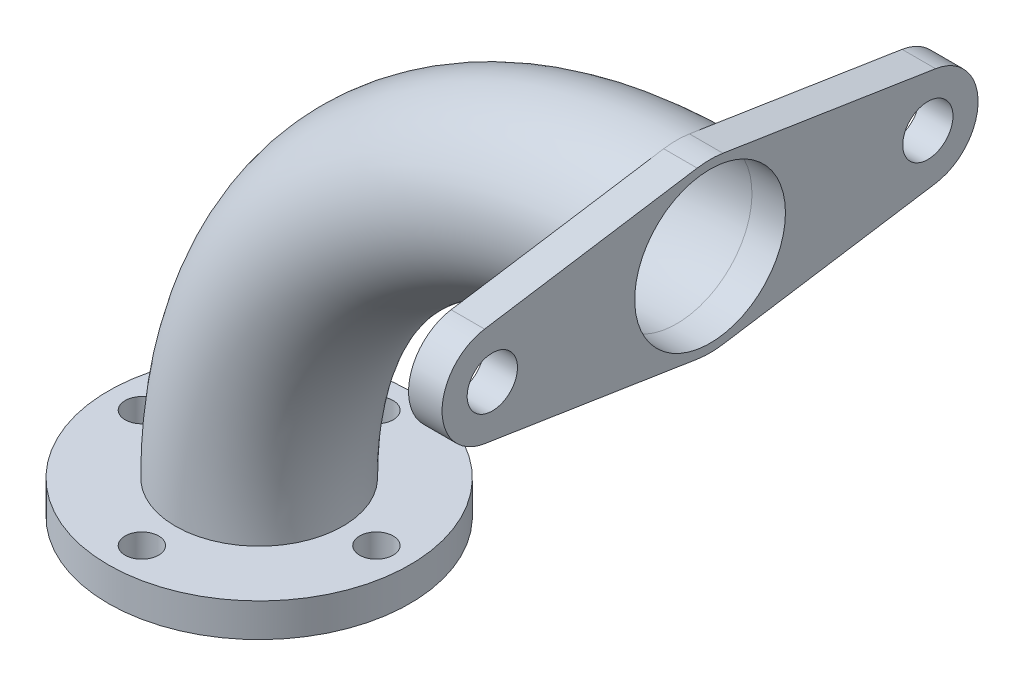
ISO-10303-21;
HEADER;
FILE_DESCRIPTION(('STEP AP214'),'2;1');
FILE_NAME('part.step','',(''),(''),'','','');
FILE_SCHEMA(('AUTOMOTIVE_DESIGN { 1 0 10303 214 1 1 1 1 }'));
ENDSEC;
DATA;
#1=APPLICATION_CONTEXT('core data for automotive mechanical design processes');
#2=APPLICATION_PROTOCOL_DEFINITION('international standard','automotive_design',2000,#1);
#3=PRODUCT_CONTEXT('',#1,'mechanical');
#4=PRODUCT('Part','Part','',(#3));
#5=PRODUCT_RELATED_PRODUCT_CATEGORY('part','',(#4));
#6=PRODUCT_DEFINITION_FORMATION('','',#4);
#7=PRODUCT_DEFINITION_CONTEXT('part definition',#1,'design');
#8=PRODUCT_DEFINITION('design','',#6,#7);
#9=PRODUCT_DEFINITION_SHAPE('','',#8);
#10=(LENGTH_UNIT() NAMED_UNIT(*) SI_UNIT(.MILLI.,.METRE.));
#11=(NAMED_UNIT(*) PLANE_ANGLE_UNIT() SI_UNIT($,.RADIAN.));
#12=(NAMED_UNIT(*) SI_UNIT($,.STERADIAN.) SOLID_ANGLE_UNIT());
#13=UNCERTAINTY_MEASURE_WITH_UNIT(LENGTH_MEASURE(1.E-05),#10,'distance_accuracy_value','');
#14=(GEOMETRIC_REPRESENTATION_CONTEXT(3) GLOBAL_UNCERTAINTY_ASSIGNED_CONTEXT((#13)) GLOBAL_UNIT_ASSIGNED_CONTEXT((#10,
#11,#12)) REPRESENTATION_CONTEXT('',''));
#15=CARTESIAN_POINT('',(0.,0.,0.));
#16=DIRECTION('',(0.,0.,1.));
#17=DIRECTION('',(1.,0.,0.));
#18=AXIS2_PLACEMENT_3D('',#15,#16,#17);
#19=CARTESIAN_POINT('',(0.,10.,0.));
#20=DIRECTION('',(0.,1.,0.));
#21=DIRECTION('',(0.,0.,1.));
#22=AXIS2_PLACEMENT_3D('',#19,#20,#21);
#23=PLANE('',#22);
#24=CARTESIAN_POINT('',(-35.,10.,0.));
#25=DIRECTION('',(0.,1.,0.));
#26=DIRECTION('',(0.,0.,1.));
#27=AXIS2_PLACEMENT_3D('',#24,#25,#26);
#28=CIRCLE('',#27,5.00000000000036);
#29=CARTESIAN_POINT('',(-35.,10.,5.00000000000036));
#30=VERTEX_POINT('',#29);
#31=EDGE_CURVE('E142',#30,#30,#28,.T.);
#32=ORIENTED_EDGE('',*,*,#31,.F.);
#33=EDGE_LOOP('',(#32));
#34=FACE_BOUND('',#33,.T.);
#35=CARTESIAN_POINT('',(35.,10.,0.));
#36=DIRECTION('',(0.,1.,0.));
#37=DIRECTION('',(0.,0.,1.));
#38=AXIS2_PLACEMENT_3D('',#35,#36,#37);
#39=CIRCLE('',#38,5.00000000000012);
#40=CARTESIAN_POINT('',(35.,10.,5.00000000000012));
#41=VERTEX_POINT('',#40);
#42=EDGE_CURVE('E154',#41,#41,#39,.T.);
#43=ORIENTED_EDGE('',*,*,#42,.F.);
#44=EDGE_LOOP('',(#43));
#45=FACE_BOUND('',#44,.T.);
#46=CARTESIAN_POINT('',(0.,10.,-35.));
#47=DIRECTION('',(0.,1.,0.));
#48=DIRECTION('',(0.,0.,1.));
#49=AXIS2_PLACEMENT_3D('',#46,#47,#48);
#50=CIRCLE('',#49,5.);
#51=CARTESIAN_POINT('',(0.,10.,-30.));
#52=VERTEX_POINT('',#51);
#53=EDGE_CURVE('E166',#52,#52,#50,.T.);
#54=ORIENTED_EDGE('',*,*,#53,.F.);
#55=EDGE_LOOP('',(#54));
#56=FACE_BOUND('',#55,.T.);
#57=CARTESIAN_POINT('',(0.,10.,0.));
#58=DIRECTION('',(0.,1.,0.));
#59=DIRECTION('',(0.,0.,1.));
#60=AXIS2_PLACEMENT_3D('',#57,#58,#59);
#61=CIRCLE('',#60,45.);
#62=CARTESIAN_POINT('',(0.,10.,45.));
#63=VERTEX_POINT('',#62);
#64=EDGE_CURVE('E11',#63,#63,#61,.T.);
#65=ORIENTED_EDGE('',*,*,#64,.T.);
#66=EDGE_LOOP('',(#65));
#67=FACE_BOUND('',#66,.T.);
#68=CARTESIAN_POINT('',(0.,10.,35.));
#69=DIRECTION('',(0.,1.,0.));
#70=DIRECTION('',(0.,0.,1.));
#71=AXIS2_PLACEMENT_3D('',#68,#69,#70);
#72=CIRCLE('',#71,5.00000000000024);
#73=CARTESIAN_POINT('',(0.,10.,40.0000000000002));
#74=VERTEX_POINT('',#73);
#75=EDGE_CURVE('E148',#74,#74,#72,.T.);
#76=ORIENTED_EDGE('',*,*,#75,.F.);
#77=EDGE_LOOP('',(#76));
#78=FACE_BOUND('',#77,.T.);
#79=CARTESIAN_POINT('',(0.,10.,0.));
#80=DIRECTION('',(0.,1.,0.));
#81=DIRECTION('',(0.,0.,1.));
#82=AXIS2_PLACEMENT_3D('',#79,#80,#81);
#83=CIRCLE('',#82,25.);
#84=CARTESIAN_POINT('',(0.,10.,25.));
#85=VERTEX_POINT('',#84);
#86=EDGE_CURVE('E138',#85,#85,#83,.T.);
#87=ORIENTED_EDGE('',*,*,#86,.F.);
#88=EDGE_LOOP('',(#87));
#89=FACE_BOUND('',#88,.T.);
#90=ADVANCED_FACE('F35',(#34,#45,#56,#67,#78,#89),#23,.T.);
#91=CARTESIAN_POINT('',(0.,0.,0.));
#92=DIRECTION('',(0.,1.,0.));
#93=DIRECTION('',(0.,0.,1.));
#94=AXIS2_PLACEMENT_3D('',#91,#92,#93);
#95=PLANE('',#94);
#96=CARTESIAN_POINT('',(0.,0.,0.));
#97=DIRECTION('',(0.,1.,0.));
#98=DIRECTION('',(0.,0.,1.));
#99=AXIS2_PLACEMENT_3D('',#96,#97,#98);
#100=CIRCLE('',#99,45.);
#101=CARTESIAN_POINT('',(0.,0.,45.));
#102=VERTEX_POINT('',#101);
#103=EDGE_CURVE('E39',#102,#102,#100,.T.);
#104=ORIENTED_EDGE('',*,*,#103,.F.);
#105=EDGE_LOOP('',(#104));
#106=FACE_BOUND('',#105,.T.);
#107=CARTESIAN_POINT('',(0.,0.,-35.));
#108=DIRECTION('',(0.,1.,0.));
#109=DIRECTION('',(0.,0.,1.));
#110=AXIS2_PLACEMENT_3D('',#107,#108,#109);
#111=CIRCLE('',#110,5.);
#112=CARTESIAN_POINT('',(0.,0.,-30.));
#113=VERTEX_POINT('',#112);
#114=EDGE_CURVE('E163',#113,#113,#111,.T.);
#115=ORIENTED_EDGE('',*,*,#114,.T.);
#116=EDGE_LOOP('',(#115));
#117=FACE_BOUND('',#116,.T.);
#118=CARTESIAN_POINT('',(0.,0.,0.));
#119=DIRECTION('',(0.,1.,0.));
#120=DIRECTION('',(0.,0.,1.));
#121=AXIS2_PLACEMENT_3D('',#118,#119,#120);
#122=CIRCLE('',#121,22.5);
#123=CARTESIAN_POINT('',(0.,0.,22.5));
#124=VERTEX_POINT('',#123);
#125=EDGE_CURVE('E157',#124,#124,#122,.T.);
#126=ORIENTED_EDGE('',*,*,#125,.T.);
#127=EDGE_LOOP('',(#126));
#128=FACE_BOUND('',#127,.T.);
#129=CARTESIAN_POINT('',(35.,0.,0.));
#130=DIRECTION('',(0.,1.,0.));
#131=DIRECTION('',(0.,0.,1.));
#132=AXIS2_PLACEMENT_3D('',#129,#130,#131);
#133=CIRCLE('',#132,5.00000000000012);
#134=CARTESIAN_POINT('',(35.,0.,5.00000000000012));
#135=VERTEX_POINT('',#134);
#136=EDGE_CURVE('E151',#135,#135,#133,.T.);
#137=ORIENTED_EDGE('',*,*,#136,.T.);
#138=EDGE_LOOP('',(#137));
#139=FACE_BOUND('',#138,.T.);
#140=CARTESIAN_POINT('',(0.,0.,35.));
#141=DIRECTION('',(0.,1.,0.));
#142=DIRECTION('',(0.,0.,1.));
#143=AXIS2_PLACEMENT_3D('',#140,#141,#142);
#144=CIRCLE('',#143,5.00000000000024);
#145=CARTESIAN_POINT('',(0.,0.,40.0000000000002));
#146=VERTEX_POINT('',#145);
#147=EDGE_CURVE('E145',#146,#146,#144,.T.);
#148=ORIENTED_EDGE('',*,*,#147,.T.);
#149=EDGE_LOOP('',(#148));
#150=FACE_BOUND('',#149,.T.);
#151=CARTESIAN_POINT('',(-35.,0.,0.));
#152=DIRECTION('',(0.,1.,0.));
#153=DIRECTION('',(0.,0.,1.));
#154=AXIS2_PLACEMENT_3D('',#151,#152,#153);
#155=CIRCLE('',#154,5.00000000000036);
#156=CARTESIAN_POINT('',(-35.,0.,5.00000000000036));
#157=VERTEX_POINT('',#156);
#158=EDGE_CURVE('E137',#157,#157,#155,.T.);
#159=ORIENTED_EDGE('',*,*,#158,.T.);
#160=EDGE_LOOP('',(#159));
#161=FACE_BOUND('',#160,.T.);
#162=ADVANCED_FACE('F172',(#106,#117,#128,#139,#150,#161),#95,.F.);
#163=CARTESIAN_POINT('',(0.,10.,0.));
#164=DIRECTION('',(0.,-1.,0.));
#165=DIRECTION('',(0.,0.,-1.));
#166=AXIS2_PLACEMENT_3D('',#163,#164,#165);
#167=CYLINDRICAL_SURFACE('',#166,45.);
#168=ORIENTED_EDGE('',*,*,#64,.F.);
#169=EDGE_LOOP('',(#168));
#170=FACE_BOUND('',#169,.T.);
#171=ORIENTED_EDGE('',*,*,#103,.T.);
#172=EDGE_LOOP('',(#171));
#173=FACE_BOUND('',#172,.T.);
#174=ADVANCED_FACE('F37',(#170,#173),#167,.T.);
#175=CARTESIAN_POINT('',(0.,10.,-35.));
#176=DIRECTION('',(0.,-1.,0.));
#177=DIRECTION('',(0.,0.,-1.));
#178=AXIS2_PLACEMENT_3D('',#175,#176,#177);
#179=CYLINDRICAL_SURFACE('',#178,5.);
#180=ORIENTED_EDGE('',*,*,#53,.T.);
#181=EDGE_LOOP('',(#180));
#182=FACE_BOUND('',#181,.T.);
#183=ORIENTED_EDGE('',*,*,#114,.F.);
#184=EDGE_LOOP('',(#183));
#185=FACE_BOUND('',#184,.T.);
#186=ADVANCED_FACE('F175',(#182,#185),#179,.F.);
#187=CARTESIAN_POINT('',(0.,10.,0.));
#188=DIRECTION('',(0.,-1.,0.));
#189=DIRECTION('',(0.,0.,-1.));
#190=AXIS2_PLACEMENT_3D('',#187,#188,#189);
#191=CYLINDRICAL_SURFACE('',#190,22.5);
#192=CARTESIAN_POINT('',(0.,10.,0.));
#193=DIRECTION('',(0.,1.,0.));
#194=DIRECTION('',(0.,0.,1.));
#195=AXIS2_PLACEMENT_3D('',#192,#193,#194);
#196=CIRCLE('',#195,22.5);
#197=CARTESIAN_POINT('',(-22.5,10.,0.));
#198=VERTEX_POINT('',#197);
#199=EDGE_CURVE('E160',#198,#198,#196,.T.);
#200=ORIENTED_EDGE('',*,*,#199,.T.);
#201=EDGE_LOOP('',(#200));
#202=FACE_BOUND('',#201,.T.);
#203=ORIENTED_EDGE('',*,*,#125,.F.);
#204=EDGE_LOOP('',(#203));
#205=FACE_BOUND('',#204,.T.);
#206=ADVANCED_FACE('F177',(#202,#205),#191,.F.);
#207=CARTESIAN_POINT('',(35.,10.,0.));
#208=DIRECTION('',(0.,-1.,0.));
#209=DIRECTION('',(0.,0.,-1.));
#210=AXIS2_PLACEMENT_3D('',#207,#208,#209);
#211=CYLINDRICAL_SURFACE('',#210,5.00000000000012);
#212=ORIENTED_EDGE('',*,*,#42,.T.);
#213=EDGE_LOOP('',(#212));
#214=FACE_BOUND('',#213,.T.);
#215=ORIENTED_EDGE('',*,*,#136,.F.);
#216=EDGE_LOOP('',(#215));
#217=FACE_BOUND('',#216,.T.);
#218=ADVANCED_FACE('F184',(#214,#217),#211,.F.);
#219=CARTESIAN_POINT('',(0.,10.,35.));
#220=DIRECTION('',(0.,-1.,0.));
#221=DIRECTION('',(0.,0.,-1.));
#222=AXIS2_PLACEMENT_3D('',#219,#220,#221);
#223=CYLINDRICAL_SURFACE('',#222,5.00000000000024);
#224=ORIENTED_EDGE('',*,*,#75,.T.);
#225=EDGE_LOOP('',(#224));
#226=FACE_BOUND('',#225,.T.);
#227=ORIENTED_EDGE('',*,*,#147,.F.);
#228=EDGE_LOOP('',(#227));
#229=FACE_BOUND('',#228,.T.);
#230=ADVANCED_FACE('F311',(#226,#229),#223,.F.);
#231=CARTESIAN_POINT('',(-35.,10.,0.));
#232=DIRECTION('',(0.,-1.,0.));
#233=DIRECTION('',(0.,0.,-1.));
#234=AXIS2_PLACEMENT_3D('',#231,#232,#233);
#235=CYLINDRICAL_SURFACE('',#234,5.00000000000036);
#236=ORIENTED_EDGE('',*,*,#31,.T.);
#237=EDGE_LOOP('',(#236));
#238=FACE_BOUND('',#237,.T.);
#239=ORIENTED_EDGE('',*,*,#158,.F.);
#240=EDGE_LOOP('',(#239));
#241=FACE_BOUND('',#240,.T.);
#242=ADVANCED_FACE('F210',(#238,#241),#235,.F.);
#243=CARTESIAN_POINT('',(124.599357943771,9.99999999999999,0.));
#244=DIRECTION('',(0.,0.,1.));
#245=DIRECTION('',(1.,0.,0.));
#246=AXIS2_PLACEMENT_3D('',#243,#244,#245);
#247=TOROIDAL_SURFACE('',#246,124.599357943771,25.);
#248=ORIENTED_EDGE('',*,*,#86,.T.);
#249=EDGE_LOOP('',(#248));
#250=FACE_BOUND('',#249,.T.);
#251=CARTESIAN_POINT('',(124.599357943771,134.599357943771,0.));
#252=DIRECTION('',(1.,0.,0.));
#253=DIRECTION('',(0.,0.,1.));
#254=AXIS2_PLACEMENT_3D('',#251,#252,#253);
#255=CIRCLE('',#254,25.);
#256=CARTESIAN_POINT('',(124.599357943771,109.896987600184,3.84615384615385));
#257=VERTEX_POINT('',#256);
#258=CARTESIAN_POINT('',(124.599357943771,109.896987600184,-3.84615384615386));
#259=VERTEX_POINT('',#258);
#260=EDGE_CURVE('E129',#257,#259,#255,.T.);
#261=ORIENTED_EDGE('',*,*,#260,.F.);
#262=CARTESIAN_POINT('',(124.599357943771,159.301728287358,3.84615384615386));
#263=VERTEX_POINT('',#262);
#264=EDGE_CURVE('E50',#263,#257,#255,.T.);
#265=ORIENTED_EDGE('',*,*,#264,.F.);
#266=CARTESIAN_POINT('',(124.599357943771,134.599357943771,0.));
#267=DIRECTION('',(1.,0.,0.));
#268=DIRECTION('',(0.,0.,-1.));
#269=AXIS2_PLACEMENT_3D('',#266,#267,#268);
#270=CIRCLE('',#269,25.);
#271=CARTESIAN_POINT('',(124.599357943771,159.301728287358,-3.84615384615385));
#272=VERTEX_POINT('',#271);
#273=EDGE_CURVE('E54',#272,#263,#270,.T.);
#274=ORIENTED_EDGE('',*,*,#273,.F.);
#275=EDGE_CURVE('E127',#259,#272,#255,.T.);
#276=ORIENTED_EDGE('',*,*,#275,.F.);
#277=EDGE_LOOP('',(#261,#265,#274,#276));
#278=FACE_BOUND('',#277,.T.);
#279=ADVANCED_FACE('F207',(#250,#278),#247,.T.);
#280=CARTESIAN_POINT('',(124.599357943771,9.99999999999999,0.));
#281=DIRECTION('',(0.,0.,1.));
#282=DIRECTION('',(1.,0.,0.));
#283=AXIS2_PLACEMENT_3D('',#280,#281,#282);
#284=TOROIDAL_SURFACE('',#283,124.599357943771,22.5);
#285=CARTESIAN_POINT('',(124.599357943771,134.599357943771,0.));
#286=DIRECTION('',(1.,0.,0.));
#287=DIRECTION('',(0.,0.,1.));
#288=AXIS2_PLACEMENT_3D('',#285,#286,#287);
#289=CIRCLE('',#288,22.5);
#290=CARTESIAN_POINT('',(124.599357943771,157.099357943771,0.));
#291=VERTEX_POINT('',#290);
#292=EDGE_CURVE('E134',#291,#291,#289,.F.);
#293=CARTESIAN_POINT('',(124.599357943771,9.99999999999999,0.));
#294=DIRECTION('',(0.,0.,1.));
#295=DIRECTION('',(1.,0.,0.));
#296=AXIS2_PLACEMENT_3D('',#293,#294,#295);
#297=CIRCLE('',#296,147.099357943771);
#298=EDGE_CURVE('',#291,#198,#297,.T.);
#299=ORIENTED_EDGE('',*,*,#292,.F.);
#300=ORIENTED_EDGE('',*,*,#199,.F.);
#301=ORIENTED_EDGE('',*,*,#298,.T.);
#302=ORIENTED_EDGE('',*,*,#298,.F.);
#303=EDGE_LOOP('',(#299,#301,#300,#302));
#304=FACE_BOUND('',#303,.T.);
#305=ADVANCED_FACE('F209',(#304),#284,.F.);
#306=CARTESIAN_POINT('',(124.599357943771,0.,0.));
#307=DIRECTION('',(1.,0.,0.));
#308=DIRECTION('',(0.,0.,-1.));
#309=AXIS2_PLACEMENT_3D('',#306,#307,#308);
#310=PLANE('',#309);
#311=CARTESIAN_POINT('',(124.599357943771,134.599357943771,-65.));
#312=DIRECTION('',(1.,0.,0.));
#313=DIRECTION('',(0.,0.,-1.));
#314=AXIS2_PLACEMENT_3D('',#311,#312,#313);
#315=CIRCLE('',#314,7.50000000000001);
#316=CARTESIAN_POINT('',(124.599357943771,134.599357943771,-72.5));
#317=VERTEX_POINT('',#316);
#318=EDGE_CURVE('E237',#317,#317,#315,.F.);
#319=ORIENTED_EDGE('',*,*,#318,.F.);
#320=EDGE_LOOP('',(#319));
#321=FACE_BOUND('',#320,.T.);
#322=DIRECTION('',(0.,0.153846153846154,-0.988094813743472));
#323=VECTOR('',#322,1.);
#324=CARTESIAN_POINT('',(124.599357943771,106.711203980213,16.6149119257602));
#325=LINE('',#324,#323);
#326=CARTESIAN_POINT('',(124.599357943771,119.777935737619,-67.3076923076923));
#327=VERTEX_POINT('',#326);
#328=EDGE_CURVE('E228',#259,#327,#325,.T.);
#329=ORIENTED_EDGE('',*,*,#328,.F.);
#330=ORIENTED_EDGE('',*,*,#275,.T.);
#331=DIRECTION('',(0.,-0.153846153846154,-0.988094813743472));
#332=VECTOR('',#331,1.);
#333=CARTESIAN_POINT('',(124.599357943771,156.115944667387,-24.3072196180679));
#334=LINE('',#333,#332);
#335=CARTESIAN_POINT('',(124.599357943771,149.420780149923,-67.3076923076923));
#336=VERTEX_POINT('',#335);
#337=EDGE_CURVE('E238',#272,#336,#334,.T.);
#338=ORIENTED_EDGE('',*,*,#337,.T.);
#339=CARTESIAN_POINT('',(124.599357943771,134.599357943771,-65.));
#340=DIRECTION('',(1.,0.,0.));
#341=DIRECTION('',(0.,0.,-1.));
#342=AXIS2_PLACEMENT_3D('',#339,#340,#341);
#343=CIRCLE('',#342,15.);
#344=EDGE_CURVE('E232',#336,#327,#343,.F.);
#345=ORIENTED_EDGE('',*,*,#344,.T.);
#346=EDGE_LOOP('',(#329,#330,#338,#345));
#347=FACE_BOUND('',#346,.T.);
#348=ADVANCED_FACE('F212',(#321,#347),#310,.F.);
#349=CARTESIAN_POINT('',(124.599357943771,134.599357943771,65.));
#350=DIRECTION('',(1.,0.,0.));
#351=DIRECTION('',(0.,0.,-1.));
#352=AXIS2_PLACEMENT_3D('',#349,#350,#351);
#353=CIRCLE('',#352,7.5);
#354=CARTESIAN_POINT('',(124.599357943771,134.599357943771,57.5));
#355=VERTEX_POINT('',#354);
#356=EDGE_CURVE('E282',#355,#355,#353,.T.);
#357=ORIENTED_EDGE('',*,*,#356,.T.);
#358=EDGE_LOOP('',(#357));
#359=FACE_BOUND('',#358,.T.);
#360=DIRECTION('',(0.,-0.153846153846154,0.988094813743472));
#361=VECTOR('',#360,1.);
#362=CARTESIAN_POINT('',(124.599357943771,156.115944667387,24.307219618068));
#363=LINE('',#362,#361);
#364=CARTESIAN_POINT('',(124.599357943771,149.420780149923,67.3076923076923));
#365=VERTEX_POINT('',#364);
#366=EDGE_CURVE('E125',#263,#365,#363,.T.);
#367=ORIENTED_EDGE('',*,*,#366,.F.);
#368=ORIENTED_EDGE('',*,*,#264,.T.);
#369=DIRECTION('',(0.,0.153846153846154,0.988094813743472));
#370=VECTOR('',#369,1.);
#371=CARTESIAN_POINT('',(124.599357943771,106.711203980213,-16.6149119257602));
#372=LINE('',#371,#370);
#373=CARTESIAN_POINT('',(124.599357943771,119.777935737619,67.3076923076923));
#374=VERTEX_POINT('',#373);
#375=EDGE_CURVE('E221',#257,#374,#372,.T.);
#376=ORIENTED_EDGE('',*,*,#375,.T.);
#377=CARTESIAN_POINT('',(124.599357943771,134.599357943771,65.));
#378=DIRECTION('',(1.,0.,0.));
#379=DIRECTION('',(0.,0.,-1.));
#380=AXIS2_PLACEMENT_3D('',#377,#378,#379);
#381=CIRCLE('',#380,15.);
#382=EDGE_CURVE('E229',#365,#374,#381,.T.);
#383=ORIENTED_EDGE('',*,*,#382,.F.);
#384=EDGE_LOOP('',(#367,#368,#376,#383));
#385=FACE_BOUND('',#384,.T.);
#386=ADVANCED_FACE('F219',(#359,#385),#310,.F.);
#387=CARTESIAN_POINT('',(134.599357943771,156.115944667387,24.307219618068));
#388=DIRECTION('',(0.,-0.988094813743472,-0.153846153846154));
#389=DIRECTION('',(0.,0.153846153846154,-0.988094813743472));
#390=AXIS2_PLACEMENT_3D('',#387,#388,#389);
#391=PLANE('',#390);
#392=ORIENTED_EDGE('',*,*,#366,.T.);
#393=DIRECTION('',(-1.,0.,0.));
#394=VECTOR('',#393,1.);
#395=CARTESIAN_POINT('',(134.599357943771,149.420780149923,67.3076923076923));
#396=LINE('',#395,#394);
#397=CARTESIAN_POINT('',(134.599357943771,149.420780149923,67.3076923076923));
#398=VERTEX_POINT('',#397);
#399=EDGE_CURVE('E103',#398,#365,#396,.T.);
#400=ORIENTED_EDGE('',*,*,#399,.F.);
#401=DIRECTION('',(0.,-0.153846153846154,0.988094813743472));
#402=VECTOR('',#401,1.);
#403=CARTESIAN_POINT('',(134.599357943771,156.115944667387,24.307219618068));
#404=LINE('',#403,#402);
#405=CARTESIAN_POINT('',(134.599357943771,159.301728287358,3.84615384615386));
#406=VERTEX_POINT('',#405);
#407=EDGE_CURVE('E110',#406,#398,#404,.T.);
#408=ORIENTED_EDGE('',*,*,#407,.F.);
#409=DIRECTION('',(-1.,0.,0.));
#410=VECTOR('',#409,1.);
#411=CARTESIAN_POINT('',(134.599357943771,159.301728287358,3.84615384615386));
#412=LINE('',#411,#410);
#413=EDGE_CURVE('E246',#406,#263,#412,.T.);
#414=ORIENTED_EDGE('',*,*,#413,.T.);
#415=EDGE_LOOP('',(#392,#400,#408,#414));
#416=FACE_BOUND('',#415,.T.);
#417=ADVANCED_FACE('F123',(#416),#391,.F.);
#418=CARTESIAN_POINT('',(134.599357943771,134.599357943771,65.));
#419=DIRECTION('',(-1.,0.,0.));
#420=DIRECTION('',(0.,0.,1.));
#421=AXIS2_PLACEMENT_3D('',#418,#419,#420);
#422=CYLINDRICAL_SURFACE('',#421,15.);
#423=ORIENTED_EDGE('',*,*,#382,.T.);
#424=DIRECTION('',(-1.,0.,0.));
#425=VECTOR('',#424,1.);
#426=CARTESIAN_POINT('',(134.599357943771,119.777935737619,67.3076923076923));
#427=LINE('',#426,#425);
#428=CARTESIAN_POINT('',(134.599357943771,119.777935737619,67.3076923076923));
#429=VERTEX_POINT('',#428);
#430=EDGE_CURVE('E105',#429,#374,#427,.T.);
#431=ORIENTED_EDGE('',*,*,#430,.F.);
#432=CARTESIAN_POINT('',(134.599357943771,134.599357943771,65.));
#433=DIRECTION('',(1.,0.,0.));
#434=DIRECTION('',(0.,0.,-1.));
#435=AXIS2_PLACEMENT_3D('',#432,#433,#434);
#436=CIRCLE('',#435,15.);
#437=EDGE_CURVE('E98',#398,#429,#436,.T.);
#438=ORIENTED_EDGE('',*,*,#437,.F.);
#439=ORIENTED_EDGE('',*,*,#399,.T.);
#440=EDGE_LOOP('',(#423,#431,#438,#439));
#441=FACE_BOUND('',#440,.T.);
#442=ADVANCED_FACE('F101',(#441),#422,.T.);
#443=CARTESIAN_POINT('',(134.599357943771,106.711203980213,-16.6149119257602));
#444=DIRECTION('',(0.,-0.988094813743472,0.153846153846154));
#445=DIRECTION('',(0.,-0.153846153846154,-0.988094813743472));
#446=AXIS2_PLACEMENT_3D('',#443,#444,#445);
#447=PLANE('',#446);
#448=ORIENTED_EDGE('',*,*,#375,.F.);
#449=DIRECTION('',(-1.,0.,0.));
#450=VECTOR('',#449,1.);
#451=CARTESIAN_POINT('',(134.599357943771,109.896987600184,3.84615384615385));
#452=LINE('',#451,#450);
#453=CARTESIAN_POINT('',(134.599357943771,109.896987600184,3.84615384615385));
#454=VERTEX_POINT('',#453);
#455=EDGE_CURVE('E130',#454,#257,#452,.T.);
#456=ORIENTED_EDGE('',*,*,#455,.F.);
#457=DIRECTION('',(0.,0.153846153846154,0.988094813743472));
#458=VECTOR('',#457,1.);
#459=CARTESIAN_POINT('',(134.599357943771,106.711203980213,-16.6149119257602));
#460=LINE('',#459,#458);
#461=EDGE_CURVE('E109',#454,#429,#460,.T.);
#462=ORIENTED_EDGE('',*,*,#461,.T.);
#463=ORIENTED_EDGE('',*,*,#430,.T.);
#464=EDGE_LOOP('',(#448,#456,#462,#463));
#465=FACE_BOUND('',#464,.T.);
#466=ADVANCED_FACE('F227',(#465),#447,.T.);
#467=CARTESIAN_POINT('',(134.599357943771,134.599357943771,0.));
#468=DIRECTION('',(-1.,0.,0.));
#469=DIRECTION('',(0.,0.,1.));
#470=AXIS2_PLACEMENT_3D('',#467,#468,#469);
#471=CYLINDRICAL_SURFACE('',#470,25.);
#472=ORIENTED_EDGE('',*,*,#260,.T.);
#473=DIRECTION('',(-1.,0.,0.));
#474=VECTOR('',#473,1.);
#475=CARTESIAN_POINT('',(134.599357943771,109.896987600184,-3.84615384615385));
#476=LINE('',#475,#474);
#477=CARTESIAN_POINT('',(134.599357943771,109.896987600184,-3.84615384615385));
#478=VERTEX_POINT('',#477);
#479=EDGE_CURVE('E226',#478,#259,#476,.T.);
#480=ORIENTED_EDGE('',*,*,#479,.F.);
#481=CARTESIAN_POINT('',(134.599357943771,134.599357943771,0.));
#482=DIRECTION('',(1.,0.,0.));
#483=DIRECTION('',(0.,0.,-1.));
#484=AXIS2_PLACEMENT_3D('',#481,#482,#483);
#485=CIRCLE('',#484,25.);
#486=EDGE_CURVE('E224',#454,#478,#485,.T.);
#487=ORIENTED_EDGE('',*,*,#486,.F.);
#488=ORIENTED_EDGE('',*,*,#455,.T.);
#489=EDGE_LOOP('',(#472,#480,#487,#488));
#490=FACE_BOUND('',#489,.T.);
#491=ADVANCED_FACE('F223',(#490),#471,.T.);
#492=CARTESIAN_POINT('',(134.599357943771,106.711203980213,16.6149119257602));
#493=DIRECTION('',(0.,0.988094813743472,0.153846153846154));
#494=DIRECTION('',(0.,-0.153846153846154,0.988094813743472));
#495=AXIS2_PLACEMENT_3D('',#492,#493,#494);
#496=PLANE('',#495);
#497=ORIENTED_EDGE('',*,*,#328,.T.);
#498=DIRECTION('',(-1.,0.,0.));
#499=VECTOR('',#498,1.);
#500=CARTESIAN_POINT('',(134.599357943771,119.777935737619,-67.3076923076923));
#501=LINE('',#500,#499);
#502=CARTESIAN_POINT('',(134.599357943771,119.777935737619,-67.3076923076923));
#503=VERTEX_POINT('',#502);
#504=EDGE_CURVE('E254',#503,#327,#501,.T.);
#505=ORIENTED_EDGE('',*,*,#504,.F.);
#506=DIRECTION('',(0.,0.153846153846154,-0.988094813743472));
#507=VECTOR('',#506,1.);
#508=CARTESIAN_POINT('',(134.599357943771,106.711203980213,16.6149119257602));
#509=LINE('',#508,#507);
#510=EDGE_CURVE('E261',#478,#503,#509,.T.);
#511=ORIENTED_EDGE('',*,*,#510,.F.);
#512=ORIENTED_EDGE('',*,*,#479,.T.);
#513=EDGE_LOOP('',(#497,#505,#511,#512));
#514=FACE_BOUND('',#513,.T.);
#515=ADVANCED_FACE('F259',(#514),#496,.F.);
#516=CARTESIAN_POINT('',(134.599357943771,134.599357943771,-65.));
#517=DIRECTION('',(-1.,0.,0.));
#518=DIRECTION('',(0.,0.,1.));
#519=AXIS2_PLACEMENT_3D('',#516,#517,#518);
#520=CYLINDRICAL_SURFACE('',#519,15.);
#521=ORIENTED_EDGE('',*,*,#344,.F.);
#522=DIRECTION('',(-1.,0.,0.));
#523=VECTOR('',#522,1.);
#524=CARTESIAN_POINT('',(134.599357943771,149.420780149923,-67.3076923076923));
#525=LINE('',#524,#523);
#526=CARTESIAN_POINT('',(134.599357943771,149.420780149923,-67.3076923076923));
#527=VERTEX_POINT('',#526);
#528=EDGE_CURVE('E252',#527,#336,#525,.T.);
#529=ORIENTED_EDGE('',*,*,#528,.F.);
#530=CARTESIAN_POINT('',(134.599357943771,134.599357943771,-65.));
#531=DIRECTION('',(1.,0.,0.));
#532=DIRECTION('',(0.,0.,-1.));
#533=AXIS2_PLACEMENT_3D('',#530,#531,#532);
#534=CIRCLE('',#533,15.);
#535=EDGE_CURVE('E269',#527,#503,#534,.F.);
#536=ORIENTED_EDGE('',*,*,#535,.T.);
#537=ORIENTED_EDGE('',*,*,#504,.T.);
#538=EDGE_LOOP('',(#521,#529,#536,#537));
#539=FACE_BOUND('',#538,.T.);
#540=ADVANCED_FACE('F266',(#539),#520,.T.);
#541=CARTESIAN_POINT('',(134.599357943771,156.115944667387,-24.3072196180679));
#542=DIRECTION('',(0.,0.988094813743472,-0.153846153846154));
#543=DIRECTION('',(0.,0.153846153846154,0.988094813743472));
#544=AXIS2_PLACEMENT_3D('',#541,#542,#543);
#545=PLANE('',#544);
#546=ORIENTED_EDGE('',*,*,#337,.F.);
#547=DIRECTION('',(-1.,0.,0.));
#548=VECTOR('',#547,1.);
#549=CARTESIAN_POINT('',(134.599357943771,159.301728287358,-3.84615384615384));
#550=LINE('',#549,#548);
#551=CARTESIAN_POINT('',(134.599357943771,159.301728287358,-3.84615384615384));
#552=VERTEX_POINT('',#551);
#553=EDGE_CURVE('E248',#552,#272,#550,.T.);
#554=ORIENTED_EDGE('',*,*,#553,.F.);
#555=DIRECTION('',(0.,-0.153846153846154,-0.988094813743472));
#556=VECTOR('',#555,1.);
#557=CARTESIAN_POINT('',(134.599357943771,156.115944667387,-24.3072196180679));
#558=LINE('',#557,#556);
#559=EDGE_CURVE('E271',#552,#527,#558,.T.);
#560=ORIENTED_EDGE('',*,*,#559,.T.);
#561=ORIENTED_EDGE('',*,*,#528,.T.);
#562=EDGE_LOOP('',(#546,#554,#560,#561));
#563=FACE_BOUND('',#562,.T.);
#564=ADVANCED_FACE('F392',(#563),#545,.T.);
#565=CARTESIAN_POINT('',(134.599357943771,134.599357943771,0.));
#566=DIRECTION('',(-1.,0.,0.));
#567=DIRECTION('',(0.,0.,1.));
#568=AXIS2_PLACEMENT_3D('',#565,#566,#567);
#569=CYLINDRICAL_SURFACE('',#568,22.5);
#570=CARTESIAN_POINT('',(134.599357943771,134.599357943771,0.));
#571=DIRECTION('',(1.,0.,0.));
#572=DIRECTION('',(0.,0.,-1.));
#573=AXIS2_PLACEMENT_3D('',#570,#571,#572);
#574=CIRCLE('',#573,22.5);
#575=CARTESIAN_POINT('',(134.599357943771,134.599357943771,-22.5));
#576=VERTEX_POINT('',#575);
#577=EDGE_CURVE('E277',#576,#576,#574,.F.);
#578=ORIENTED_EDGE('',*,*,#577,.F.);
#579=EDGE_LOOP('',(#578));
#580=FACE_BOUND('',#579,.T.);
#581=ORIENTED_EDGE('',*,*,#292,.T.);
#582=EDGE_LOOP('',(#581));
#583=FACE_BOUND('',#582,.T.);
#584=ADVANCED_FACE('F299',(#580,#583),#569,.F.);
#585=ORIENTED_EDGE('',*,*,#273,.T.);
#586=ORIENTED_EDGE('',*,*,#413,.F.);
#587=EDGE_CURVE('E117',#552,#406,#485,.T.);
#588=ORIENTED_EDGE('',*,*,#587,.F.);
#589=ORIENTED_EDGE('',*,*,#553,.T.);
#590=EDGE_LOOP('',(#585,#586,#588,#589));
#591=FACE_BOUND('',#590,.T.);
#592=ADVANCED_FACE('F290',(#591),#471,.T.);
#593=CARTESIAN_POINT('',(134.599357943771,134.599357943771,65.));
#594=DIRECTION('',(-1.,0.,0.));
#595=DIRECTION('',(0.,0.,1.));
#596=AXIS2_PLACEMENT_3D('',#593,#594,#595);
#597=CYLINDRICAL_SURFACE('',#596,7.5);
#598=CARTESIAN_POINT('',(134.599357943771,134.599357943771,65.));
#599=DIRECTION('',(1.,0.,0.));
#600=DIRECTION('',(0.,0.,-1.));
#601=AXIS2_PLACEMENT_3D('',#598,#599,#600);
#602=CIRCLE('',#601,7.5);
#603=CARTESIAN_POINT('',(134.599357943771,134.599357943771,57.5));
#604=VERTEX_POINT('',#603);
#605=EDGE_CURVE('E121',#604,#604,#602,.T.);
#606=ORIENTED_EDGE('',*,*,#605,.T.);
#607=EDGE_LOOP('',(#606));
#608=FACE_BOUND('',#607,.T.);
#609=ORIENTED_EDGE('',*,*,#356,.F.);
#610=EDGE_LOOP('',(#609));
#611=FACE_BOUND('',#610,.T.);
#612=ADVANCED_FACE('F287',(#608,#611),#597,.F.);
#613=CARTESIAN_POINT('',(134.599357943771,134.599357943771,-65.));
#614=DIRECTION('',(-1.,0.,0.));
#615=DIRECTION('',(0.,0.,1.));
#616=AXIS2_PLACEMENT_3D('',#613,#614,#615);
#617=CYLINDRICAL_SURFACE('',#616,7.50000000000001);
#618=CARTESIAN_POINT('',(134.599357943771,134.599357943771,-65.));
#619=DIRECTION('',(1.,0.,0.));
#620=DIRECTION('',(0.,0.,-1.));
#621=AXIS2_PLACEMENT_3D('',#618,#619,#620);
#622=CIRCLE('',#621,7.50000000000001);
#623=CARTESIAN_POINT('',(134.599357943771,134.599357943771,-72.5));
#624=VERTEX_POINT('',#623);
#625=EDGE_CURVE('E249',#624,#624,#622,.F.);
#626=ORIENTED_EDGE('',*,*,#625,.F.);
#627=EDGE_LOOP('',(#626));
#628=FACE_BOUND('',#627,.T.);
#629=ORIENTED_EDGE('',*,*,#318,.T.);
#630=EDGE_LOOP('',(#629));
#631=FACE_BOUND('',#630,.T.);
#632=ADVANCED_FACE('F289',(#628,#631),#617,.F.);
#633=CARTESIAN_POINT('',(134.599357943771,0.,0.));
#634=DIRECTION('',(1.,0.,0.));
#635=DIRECTION('',(0.,0.,-1.));
#636=AXIS2_PLACEMENT_3D('',#633,#634,#635);
#637=PLANE('',#636);
#638=ORIENTED_EDGE('',*,*,#605,.F.);
#639=EDGE_LOOP('',(#638));
#640=FACE_BOUND('',#639,.T.);
#641=ORIENTED_EDGE('',*,*,#407,.T.);
#642=ORIENTED_EDGE('',*,*,#437,.T.);
#643=ORIENTED_EDGE('',*,*,#461,.F.);
#644=ORIENTED_EDGE('',*,*,#486,.T.);
#645=ORIENTED_EDGE('',*,*,#510,.T.);
#646=ORIENTED_EDGE('',*,*,#535,.F.);
#647=ORIENTED_EDGE('',*,*,#559,.F.);
#648=ORIENTED_EDGE('',*,*,#587,.T.);
#649=EDGE_LOOP('',(#641,#642,#643,#644,#645,#646,#647,#648));
#650=FACE_BOUND('',#649,.T.);
#651=ORIENTED_EDGE('',*,*,#577,.T.);
#652=EDGE_LOOP('',(#651));
#653=FACE_BOUND('',#652,.T.);
#654=ORIENTED_EDGE('',*,*,#625,.T.);
#655=EDGE_LOOP('',(#654));
#656=FACE_BOUND('',#655,.T.);
#657=ADVANCED_FACE('F113',(#640,#650,#653,#656),#637,.T.);
#658=CLOSED_SHELL('',(#90,#162,#174,#186,#206,#218,#230,#242,#279,#305,#348,#386,#417,#442,#466,
#491,#515,#540,#564,#584,#592,#612,#632,#657));
#659=MANIFOLD_SOLID_BREP('B2',#658);
#660=ADVANCED_BREP_SHAPE_REPRESENTATION('',(#18,#659),#14);
#661=SHAPE_DEFINITION_REPRESENTATION(#9,#660);
ENDSEC;
END-ISO-10303-21;
